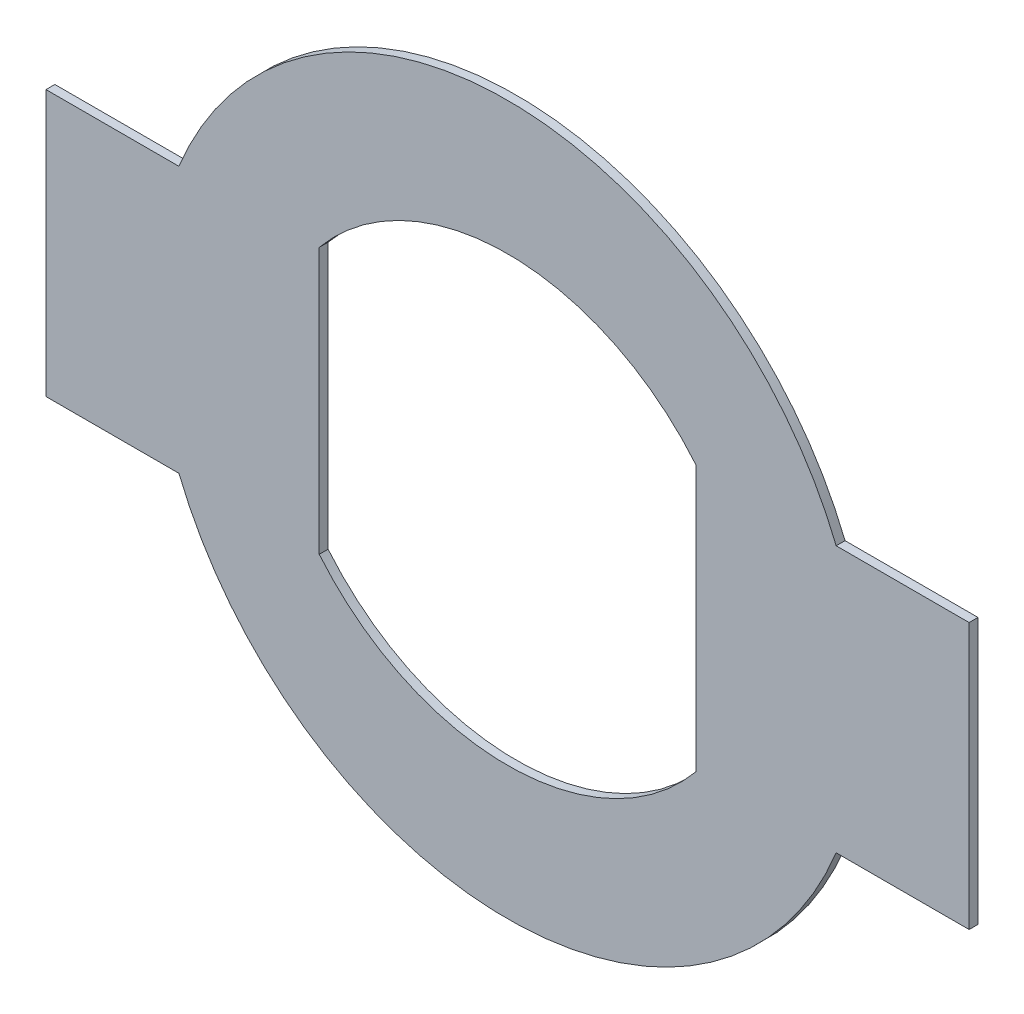
ISO-10303-21;
HEADER;
FILE_DESCRIPTION(('STEP AP214'),'2;1');
FILE_NAME('part.step','',(''),(''),'','','');
FILE_SCHEMA(('AUTOMOTIVE_DESIGN { 1 0 10303 214 1 1 1 1 }'));
ENDSEC;
DATA;
#1=APPLICATION_CONTEXT('core data for automotive mechanical design processes');
#2=APPLICATION_PROTOCOL_DEFINITION('international standard','automotive_design',2000,#1);
#3=PRODUCT_CONTEXT('',#1,'mechanical');
#4=PRODUCT('Part','Part','',(#3));
#5=PRODUCT_RELATED_PRODUCT_CATEGORY('part','',(#4));
#6=PRODUCT_DEFINITION_FORMATION('','',#4);
#7=PRODUCT_DEFINITION_CONTEXT('part definition',#1,'design');
#8=PRODUCT_DEFINITION('design','',#6,#7);
#9=PRODUCT_DEFINITION_SHAPE('','',#8);
#10=(LENGTH_UNIT() NAMED_UNIT(*) SI_UNIT(.MILLI.,.METRE.));
#11=(NAMED_UNIT(*) PLANE_ANGLE_UNIT() SI_UNIT($,.RADIAN.));
#12=(NAMED_UNIT(*) SI_UNIT($,.STERADIAN.) SOLID_ANGLE_UNIT());
#13=UNCERTAINTY_MEASURE_WITH_UNIT(LENGTH_MEASURE(1.E-05),#10,'distance_accuracy_value','');
#14=(GEOMETRIC_REPRESENTATION_CONTEXT(3) GLOBAL_UNCERTAINTY_ASSIGNED_CONTEXT((#13)) GLOBAL_UNIT_ASSIGNED_CONTEXT((#10,
#11,#12)) REPRESENTATION_CONTEXT('',''));
#15=CARTESIAN_POINT('',(0.,0.,0.));
#16=DIRECTION('',(0.,0.,1.));
#17=DIRECTION('',(1.,0.,0.));
#18=AXIS2_PLACEMENT_3D('',#15,#16,#17);
#19=CARTESIAN_POINT('',(0.,0.,-0.2));
#20=DIRECTION('',(0.,0.,1.));
#21=DIRECTION('',(1.,0.,0.));
#22=AXIS2_PLACEMENT_3D('',#19,#20,#21);
#23=CYLINDRICAL_SURFACE('',#22,8.);
#24=CARTESIAN_POINT('',(0.,0.,0.));
#25=DIRECTION('',(0.,0.,1.));
#26=DIRECTION('',(1.,0.,0.));
#27=AXIS2_PLACEMENT_3D('',#24,#25,#26);
#28=CIRCLE('',#27,8.);
#29=CARTESIAN_POINT('',(-7.41619848709566,-3.,0.));
#30=VERTEX_POINT('',#29);
#31=CARTESIAN_POINT('',(7.41619848709566,-3.,0.));
#32=VERTEX_POINT('',#31);
#33=EDGE_CURVE('E157',#30,#32,#28,.T.);
#34=ORIENTED_EDGE('',*,*,#33,.F.);
#35=DIRECTION('',(0.,0.,1.));
#36=VECTOR('',#35,1.);
#37=CARTESIAN_POINT('',(-7.41619848709566,-3.,-0.2));
#38=LINE('',#37,#36);
#39=CARTESIAN_POINT('',(-7.41619848709566,-3.,-0.2));
#40=VERTEX_POINT('',#39);
#41=EDGE_CURVE('E11',#40,#30,#38,.T.);
#42=ORIENTED_EDGE('',*,*,#41,.F.);
#43=CARTESIAN_POINT('',(0.,0.,-0.2));
#44=DIRECTION('',(0.,0.,1.));
#45=DIRECTION('',(1.,0.,0.));
#46=AXIS2_PLACEMENT_3D('',#43,#44,#45);
#47=CIRCLE('',#46,8.);
#48=CARTESIAN_POINT('',(7.41619848709566,-3.,-0.2));
#49=VERTEX_POINT('',#48);
#50=EDGE_CURVE('E161',#40,#49,#47,.T.);
#51=ORIENTED_EDGE('',*,*,#50,.T.);
#52=DIRECTION('',(0.,0.,1.));
#53=VECTOR('',#52,1.);
#54=CARTESIAN_POINT('',(7.41619848709566,-3.,-0.2));
#55=LINE('',#54,#53);
#56=EDGE_CURVE('E38',#49,#32,#55,.T.);
#57=ORIENTED_EDGE('',*,*,#56,.T.);
#58=EDGE_LOOP('',(#34,#42,#51,#57));
#59=FACE_BOUND('',#58,.T.);
#60=ADVANCED_FACE('F35',(#59),#23,.T.);
#61=CARTESIAN_POINT('',(-10.4161984870957,-3.,-0.2));
#62=DIRECTION('',(0.,-1.,0.));
#63=DIRECTION('',(0.,0.,-1.));
#64=AXIS2_PLACEMENT_3D('',#61,#62,#63);
#65=PLANE('',#64);
#66=DIRECTION('',(1.,0.,0.));
#67=VECTOR('',#66,1.);
#68=CARTESIAN_POINT('',(-10.4161984870957,-3.,0.));
#69=LINE('',#68,#67);
#70=CARTESIAN_POINT('',(-10.4161984870957,-3.,0.));
#71=VERTEX_POINT('',#70);
#72=EDGE_CURVE('E165',#71,#30,#69,.T.);
#73=ORIENTED_EDGE('',*,*,#72,.F.);
#74=DIRECTION('',(0.,0.,1.));
#75=VECTOR('',#74,1.);
#76=CARTESIAN_POINT('',(-10.4161984870957,-3.,-0.2));
#77=LINE('',#76,#75);
#78=CARTESIAN_POINT('',(-10.4161984870957,-3.,-0.2));
#79=VERTEX_POINT('',#78);
#80=EDGE_CURVE('E43',#79,#71,#77,.T.);
#81=ORIENTED_EDGE('',*,*,#80,.F.);
#82=DIRECTION('',(1.,0.,0.));
#83=VECTOR('',#82,1.);
#84=CARTESIAN_POINT('',(-10.4161984870957,-3.,-0.2));
#85=LINE('',#84,#83);
#86=EDGE_CURVE('E183',#79,#40,#85,.T.);
#87=ORIENTED_EDGE('',*,*,#86,.T.);
#88=ORIENTED_EDGE('',*,*,#41,.T.);
#89=EDGE_LOOP('',(#73,#81,#87,#88));
#90=FACE_BOUND('',#89,.T.);
#91=ADVANCED_FACE('F230',(#90),#65,.T.);
#92=CARTESIAN_POINT('',(-10.4161984870957,3.,-0.2));
#93=DIRECTION('',(-1.,0.,0.));
#94=DIRECTION('',(0.,0.,1.));
#95=AXIS2_PLACEMENT_3D('',#92,#93,#94);
#96=PLANE('',#95);
#97=DIRECTION('',(0.,-1.,0.));
#98=VECTOR('',#97,1.);
#99=CARTESIAN_POINT('',(-10.4161984870957,3.,0.));
#100=LINE('',#99,#98);
#101=CARTESIAN_POINT('',(-10.4161984870957,3.,0.));
#102=VERTEX_POINT('',#101);
#103=EDGE_CURVE('E203',#102,#71,#100,.T.);
#104=ORIENTED_EDGE('',*,*,#103,.F.);
#105=DIRECTION('',(0.,0.,1.));
#106=VECTOR('',#105,1.);
#107=CARTESIAN_POINT('',(-10.4161984870957,3.,-0.2));
#108=LINE('',#107,#106);
#109=CARTESIAN_POINT('',(-10.4161984870957,3.,-0.2));
#110=VERTEX_POINT('',#109);
#111=EDGE_CURVE('E209',#110,#102,#108,.T.);
#112=ORIENTED_EDGE('',*,*,#111,.F.);
#113=DIRECTION('',(0.,-1.,0.));
#114=VECTOR('',#113,1.);
#115=CARTESIAN_POINT('',(-10.4161984870957,3.,-0.2));
#116=LINE('',#115,#114);
#117=EDGE_CURVE('E180',#110,#79,#116,.T.);
#118=ORIENTED_EDGE('',*,*,#117,.T.);
#119=ORIENTED_EDGE('',*,*,#80,.T.);
#120=EDGE_LOOP('',(#104,#112,#118,#119));
#121=FACE_BOUND('',#120,.T.);
#122=ADVANCED_FACE('F249',(#121),#96,.T.);
#123=CARTESIAN_POINT('',(-7.41619848709566,3.,-0.2));
#124=DIRECTION('',(0.,1.,0.));
#125=DIRECTION('',(0.,0.,1.));
#126=AXIS2_PLACEMENT_3D('',#123,#124,#125);
#127=PLANE('',#126);
#128=DIRECTION('',(-1.,0.,0.));
#129=VECTOR('',#128,1.);
#130=CARTESIAN_POINT('',(-7.41619848709566,3.,0.));
#131=LINE('',#130,#129);
#132=CARTESIAN_POINT('',(-7.41619848709566,3.,0.));
#133=VERTEX_POINT('',#132);
#134=EDGE_CURVE('E200',#133,#102,#131,.T.);
#135=ORIENTED_EDGE('',*,*,#134,.F.);
#136=DIRECTION('',(0.,0.,1.));
#137=VECTOR('',#136,1.);
#138=CARTESIAN_POINT('',(-7.41619848709566,3.,-0.2));
#139=LINE('',#138,#137);
#140=CARTESIAN_POINT('',(-7.41619848709566,3.,-0.2));
#141=VERTEX_POINT('',#140);
#142=EDGE_CURVE('E211',#141,#133,#139,.T.);
#143=ORIENTED_EDGE('',*,*,#142,.F.);
#144=DIRECTION('',(-1.,0.,0.));
#145=VECTOR('',#144,1.);
#146=CARTESIAN_POINT('',(-7.41619848709566,3.,-0.2));
#147=LINE('',#146,#145);
#148=EDGE_CURVE('E177',#141,#110,#147,.T.);
#149=ORIENTED_EDGE('',*,*,#148,.T.);
#150=ORIENTED_EDGE('',*,*,#111,.T.);
#151=EDGE_LOOP('',(#135,#143,#149,#150));
#152=FACE_BOUND('',#151,.T.);
#153=ADVANCED_FACE('F247',(#152),#127,.T.);
#154=CARTESIAN_POINT('',(0.,0.,-0.2));
#155=DIRECTION('',(0.,0.,1.));
#156=DIRECTION('',(1.,0.,0.));
#157=AXIS2_PLACEMENT_3D('',#154,#155,#156);
#158=CYLINDRICAL_SURFACE('',#157,8.);
#159=CARTESIAN_POINT('',(0.,0.,0.));
#160=DIRECTION('',(0.,0.,1.));
#161=DIRECTION('',(1.,0.,0.));
#162=AXIS2_PLACEMENT_3D('',#159,#160,#161);
#163=CIRCLE('',#162,8.);
#164=CARTESIAN_POINT('',(7.41619848709566,3.,0.));
#165=VERTEX_POINT('',#164);
#166=EDGE_CURVE('E197',#165,#133,#163,.T.);
#167=ORIENTED_EDGE('',*,*,#166,.F.);
#168=DIRECTION('',(0.,0.,1.));
#169=VECTOR('',#168,1.);
#170=CARTESIAN_POINT('',(7.41619848709566,3.,-0.2));
#171=LINE('',#170,#169);
#172=CARTESIAN_POINT('',(7.41619848709566,3.,-0.2));
#173=VERTEX_POINT('',#172);
#174=EDGE_CURVE('E213',#173,#165,#171,.T.);
#175=ORIENTED_EDGE('',*,*,#174,.F.);
#176=CARTESIAN_POINT('',(0.,0.,-0.2));
#177=DIRECTION('',(0.,0.,1.));
#178=DIRECTION('',(1.,0.,0.));
#179=AXIS2_PLACEMENT_3D('',#176,#177,#178);
#180=CIRCLE('',#179,8.);
#181=EDGE_CURVE('E174',#173,#141,#180,.T.);
#182=ORIENTED_EDGE('',*,*,#181,.T.);
#183=ORIENTED_EDGE('',*,*,#142,.T.);
#184=EDGE_LOOP('',(#167,#175,#182,#183));
#185=FACE_BOUND('',#184,.T.);
#186=ADVANCED_FACE('F243',(#185),#158,.T.);
#187=CARTESIAN_POINT('',(7.41619848709566,3.,-0.2));
#188=DIRECTION('',(0.,1.,0.));
#189=DIRECTION('',(0.,0.,1.));
#190=AXIS2_PLACEMENT_3D('',#187,#188,#189);
#191=PLANE('',#190);
#192=DIRECTION('',(-1.,0.,0.));
#193=VECTOR('',#192,1.);
#194=CARTESIAN_POINT('',(7.41619848709566,3.,0.));
#195=LINE('',#194,#193);
#196=CARTESIAN_POINT('',(10.4161984870957,3.,0.));
#197=VERTEX_POINT('',#196);
#198=EDGE_CURVE('E194',#197,#165,#195,.T.);
#199=ORIENTED_EDGE('',*,*,#198,.F.);
#200=DIRECTION('',(0.,0.,1.));
#201=VECTOR('',#200,1.);
#202=CARTESIAN_POINT('',(10.4161984870957,3.,-0.2));
#203=LINE('',#202,#201);
#204=CARTESIAN_POINT('',(10.4161984870957,3.,-0.2));
#205=VERTEX_POINT('',#204);
#206=EDGE_CURVE('E215',#205,#197,#203,.T.);
#207=ORIENTED_EDGE('',*,*,#206,.F.);
#208=DIRECTION('',(-1.,0.,0.));
#209=VECTOR('',#208,1.);
#210=CARTESIAN_POINT('',(7.41619848709566,3.,-0.2));
#211=LINE('',#210,#209);
#212=EDGE_CURVE('E171',#205,#173,#211,.T.);
#213=ORIENTED_EDGE('',*,*,#212,.T.);
#214=ORIENTED_EDGE('',*,*,#174,.T.);
#215=EDGE_LOOP('',(#199,#207,#213,#214));
#216=FACE_BOUND('',#215,.T.);
#217=ADVANCED_FACE('F241',(#216),#191,.T.);
#218=CARTESIAN_POINT('',(10.4161984870957,3.,-0.2));
#219=DIRECTION('',(1.,0.,0.));
#220=DIRECTION('',(0.,0.,-1.));
#221=AXIS2_PLACEMENT_3D('',#218,#219,#220);
#222=PLANE('',#221);
#223=DIRECTION('',(0.,1.,0.));
#224=VECTOR('',#223,1.);
#225=CARTESIAN_POINT('',(10.4161984870957,3.,0.));
#226=LINE('',#225,#224);
#227=CARTESIAN_POINT('',(10.4161984870957,-3.,0.));
#228=VERTEX_POINT('',#227);
#229=EDGE_CURVE('E191',#228,#197,#226,.T.);
#230=ORIENTED_EDGE('',*,*,#229,.F.);
#231=DIRECTION('',(0.,0.,1.));
#232=VECTOR('',#231,1.);
#233=CARTESIAN_POINT('',(10.4161984870957,-3.,-0.2));
#234=LINE('',#233,#232);
#235=CARTESIAN_POINT('',(10.4161984870957,-3.,-0.2));
#236=VERTEX_POINT('',#235);
#237=EDGE_CURVE('E216',#236,#228,#234,.T.);
#238=ORIENTED_EDGE('',*,*,#237,.F.);
#239=DIRECTION('',(0.,1.,0.));
#240=VECTOR('',#239,1.);
#241=CARTESIAN_POINT('',(10.4161984870957,3.,-0.2));
#242=LINE('',#241,#240);
#243=EDGE_CURVE('E168',#236,#205,#242,.T.);
#244=ORIENTED_EDGE('',*,*,#243,.T.);
#245=ORIENTED_EDGE('',*,*,#206,.T.);
#246=EDGE_LOOP('',(#230,#238,#244,#245));
#247=FACE_BOUND('',#246,.T.);
#248=ADVANCED_FACE('F237',(#247),#222,.T.);
#249=CARTESIAN_POINT('',(10.4161984870957,-3.,-0.2));
#250=DIRECTION('',(0.,-1.,0.));
#251=DIRECTION('',(0.,0.,-1.));
#252=AXIS2_PLACEMENT_3D('',#249,#250,#251);
#253=PLANE('',#252);
#254=DIRECTION('',(1.,0.,0.));
#255=VECTOR('',#254,1.);
#256=CARTESIAN_POINT('',(10.4161984870957,-3.,0.));
#257=LINE('',#256,#255);
#258=EDGE_CURVE('E188',#32,#228,#257,.T.);
#259=ORIENTED_EDGE('',*,*,#258,.F.);
#260=ORIENTED_EDGE('',*,*,#56,.F.);
#261=DIRECTION('',(1.,0.,0.));
#262=VECTOR('',#261,1.);
#263=CARTESIAN_POINT('',(10.4161984870957,-3.,-0.2));
#264=LINE('',#263,#262);
#265=EDGE_CURVE('E164',#49,#236,#264,.T.);
#266=ORIENTED_EDGE('',*,*,#265,.T.);
#267=ORIENTED_EDGE('',*,*,#237,.T.);
#268=EDGE_LOOP('',(#259,#260,#266,#267));
#269=FACE_BOUND('',#268,.T.);
#270=ADVANCED_FACE('F224',(#269),#253,.T.);
#271=CARTESIAN_POINT('',(0.,0.,-0.2));
#272=DIRECTION('',(0.,0.,1.));
#273=DIRECTION('',(1.,0.,0.));
#274=AXIS2_PLACEMENT_3D('',#271,#272,#273);
#275=PLANE('',#274);
#276=DIRECTION('',(0.,1.,0.));
#277=VECTOR('',#276,1.);
#278=CARTESIAN_POINT('',(4.25,3.,-0.2));
#279=LINE('',#278,#277);
#280=CARTESIAN_POINT('',(4.25,-3.,-0.2));
#281=VERTEX_POINT('',#280);
#282=CARTESIAN_POINT('',(4.25,3.,-0.2));
#283=VERTEX_POINT('',#282);
#284=EDGE_CURVE('E132',#281,#283,#279,.T.);
#285=ORIENTED_EDGE('',*,*,#284,.T.);
#286=CARTESIAN_POINT('',(0.,-0.515625000000006,-0.2));
#287=DIRECTION('',(0.,0.,1.));
#288=DIRECTION('',(-1.,0.,0.));
#289=AXIS2_PLACEMENT_3D('',#286,#287,#288);
#290=CIRCLE('',#289,5.515625);
#291=CARTESIAN_POINT('',(-4.25,3.,-0.2));
#292=VERTEX_POINT('',#291);
#293=EDGE_CURVE('E126',#283,#292,#290,.T.);
#294=ORIENTED_EDGE('',*,*,#293,.T.);
#295=DIRECTION('',(0.,-1.,0.));
#296=VECTOR('',#295,1.);
#297=CARTESIAN_POINT('',(-4.25,3.,-0.2));
#298=LINE('',#297,#296);
#299=CARTESIAN_POINT('',(-4.25,-3.,-0.2));
#300=VERTEX_POINT('',#299);
#301=EDGE_CURVE('E135',#292,#300,#298,.T.);
#302=ORIENTED_EDGE('',*,*,#301,.T.);
#303=CARTESIAN_POINT('',(0.,0.515625000000006,-0.2));
#304=DIRECTION('',(0.,0.,1.));
#305=DIRECTION('',(1.,0.,0.));
#306=AXIS2_PLACEMENT_3D('',#303,#304,#305);
#307=CIRCLE('',#306,5.515625);
#308=EDGE_CURVE('E51',#300,#281,#307,.T.);
#309=ORIENTED_EDGE('',*,*,#308,.T.);
#310=EDGE_LOOP('',(#285,#294,#302,#309));
#311=FACE_BOUND('',#310,.T.);
#312=ORIENTED_EDGE('',*,*,#50,.F.);
#313=ORIENTED_EDGE('',*,*,#86,.F.);
#314=ORIENTED_EDGE('',*,*,#117,.F.);
#315=ORIENTED_EDGE('',*,*,#148,.F.);
#316=ORIENTED_EDGE('',*,*,#181,.F.);
#317=ORIENTED_EDGE('',*,*,#212,.F.);
#318=ORIENTED_EDGE('',*,*,#243,.F.);
#319=ORIENTED_EDGE('',*,*,#265,.F.);
#320=EDGE_LOOP('',(#312,#313,#314,#315,#316,#317,#318,#319));
#321=FACE_BOUND('',#320,.T.);
#322=ADVANCED_FACE('F139',(#311,#321),#275,.F.);
#323=CARTESIAN_POINT('',(0.,0.,0.));
#324=DIRECTION('',(0.,0.,1.));
#325=DIRECTION('',(1.,0.,0.));
#326=AXIS2_PLACEMENT_3D('',#323,#324,#325);
#327=PLANE('',#326);
#328=CARTESIAN_POINT('',(0.,-0.515625000000006,0.));
#329=DIRECTION('',(0.,0.,1.));
#330=DIRECTION('',(-1.,0.,0.));
#331=AXIS2_PLACEMENT_3D('',#328,#329,#330);
#332=CIRCLE('',#331,5.515625);
#333=CARTESIAN_POINT('',(4.25,3.,0.));
#334=VERTEX_POINT('',#333);
#335=CARTESIAN_POINT('',(-4.25,3.,0.));
#336=VERTEX_POINT('',#335);
#337=EDGE_CURVE('E59',#334,#336,#332,.T.);
#338=ORIENTED_EDGE('',*,*,#337,.F.);
#339=DIRECTION('',(0.,1.,0.));
#340=VECTOR('',#339,1.);
#341=CARTESIAN_POINT('',(4.25,3.,0.));
#342=LINE('',#341,#340);
#343=CARTESIAN_POINT('',(4.25,-3.,0.));
#344=VERTEX_POINT('',#343);
#345=EDGE_CURVE('E142',#344,#334,#342,.T.);
#346=ORIENTED_EDGE('',*,*,#345,.F.);
#347=CARTESIAN_POINT('',(0.,0.515625000000006,0.));
#348=DIRECTION('',(0.,0.,1.));
#349=DIRECTION('',(1.,0.,0.));
#350=AXIS2_PLACEMENT_3D('',#347,#348,#349);
#351=CIRCLE('',#350,5.515625);
#352=CARTESIAN_POINT('',(-4.25,-3.,0.));
#353=VERTEX_POINT('',#352);
#354=EDGE_CURVE('E145',#353,#344,#351,.T.);
#355=ORIENTED_EDGE('',*,*,#354,.F.);
#356=DIRECTION('',(0.,-1.,0.));
#357=VECTOR('',#356,1.);
#358=CARTESIAN_POINT('',(-4.25,3.,0.));
#359=LINE('',#358,#357);
#360=EDGE_CURVE('E151',#336,#353,#359,.T.);
#361=ORIENTED_EDGE('',*,*,#360,.F.);
#362=EDGE_LOOP('',(#338,#346,#355,#361));
#363=FACE_BOUND('',#362,.T.);
#364=ORIENTED_EDGE('',*,*,#33,.T.);
#365=ORIENTED_EDGE('',*,*,#258,.T.);
#366=ORIENTED_EDGE('',*,*,#229,.T.);
#367=ORIENTED_EDGE('',*,*,#198,.T.);
#368=ORIENTED_EDGE('',*,*,#166,.T.);
#369=ORIENTED_EDGE('',*,*,#134,.T.);
#370=ORIENTED_EDGE('',*,*,#103,.T.);
#371=ORIENTED_EDGE('',*,*,#72,.T.);
#372=EDGE_LOOP('',(#364,#365,#366,#367,#368,#369,#370,#371));
#373=FACE_BOUND('',#372,.T.);
#374=ADVANCED_FACE('F226',(#363,#373),#327,.T.);
#375=CARTESIAN_POINT('',(0.,-0.515625000000006,-0.2));
#376=DIRECTION('',(0.,0.,1.));
#377=DIRECTION('',(1.,0.,0.));
#378=AXIS2_PLACEMENT_3D('',#375,#376,#377);
#379=CYLINDRICAL_SURFACE('',#378,5.515625);
#380=ORIENTED_EDGE('',*,*,#337,.T.);
#381=DIRECTION('',(0.,0.,1.));
#382=VECTOR('',#381,1.);
#383=CARTESIAN_POINT('',(-4.25,3.,-0.2));
#384=LINE('',#383,#382);
#385=EDGE_CURVE('E122',#292,#336,#384,.T.);
#386=ORIENTED_EDGE('',*,*,#385,.F.);
#387=ORIENTED_EDGE('',*,*,#293,.F.);
#388=DIRECTION('',(0.,0.,1.));
#389=VECTOR('',#388,1.);
#390=CARTESIAN_POINT('',(4.25,3.,-0.2));
#391=LINE('',#390,#389);
#392=EDGE_CURVE('E155',#283,#334,#391,.T.);
#393=ORIENTED_EDGE('',*,*,#392,.T.);
#394=EDGE_LOOP('',(#380,#386,#387,#393));
#395=FACE_BOUND('',#394,.T.);
#396=ADVANCED_FACE('F124',(#395),#379,.F.);
#397=CARTESIAN_POINT('',(4.25,3.,-0.2));
#398=DIRECTION('',(1.,0.,0.));
#399=DIRECTION('',(0.,0.,-1.));
#400=AXIS2_PLACEMENT_3D('',#397,#398,#399);
#401=PLANE('',#400);
#402=ORIENTED_EDGE('',*,*,#345,.T.);
#403=ORIENTED_EDGE('',*,*,#392,.F.);
#404=ORIENTED_EDGE('',*,*,#284,.F.);
#405=DIRECTION('',(0.,0.,1.));
#406=VECTOR('',#405,1.);
#407=CARTESIAN_POINT('',(4.25,-3.,-0.2));
#408=LINE('',#407,#406);
#409=EDGE_CURVE('E158',#281,#344,#408,.T.);
#410=ORIENTED_EDGE('',*,*,#409,.T.);
#411=EDGE_LOOP('',(#402,#403,#404,#410));
#412=FACE_BOUND('',#411,.T.);
#413=ADVANCED_FACE('F341',(#412),#401,.F.);
#414=CARTESIAN_POINT('',(0.,0.515625000000006,-0.2));
#415=DIRECTION('',(0.,0.,1.));
#416=DIRECTION('',(1.,0.,0.));
#417=AXIS2_PLACEMENT_3D('',#414,#415,#416);
#418=CYLINDRICAL_SURFACE('',#417,5.515625);
#419=ORIENTED_EDGE('',*,*,#354,.T.);
#420=ORIENTED_EDGE('',*,*,#409,.F.);
#421=ORIENTED_EDGE('',*,*,#308,.F.);
#422=DIRECTION('',(0.,0.,1.));
#423=VECTOR('',#422,1.);
#424=CARTESIAN_POINT('',(-4.25,-3.,-0.2));
#425=LINE('',#424,#423);
#426=EDGE_CURVE('E131',#300,#353,#425,.T.);
#427=ORIENTED_EDGE('',*,*,#426,.T.);
#428=EDGE_LOOP('',(#419,#420,#421,#427));
#429=FACE_BOUND('',#428,.T.);
#430=ADVANCED_FACE('F351',(#429),#418,.F.);
#431=CARTESIAN_POINT('',(-4.25,3.,-0.2));
#432=DIRECTION('',(-1.,0.,0.));
#433=DIRECTION('',(0.,0.,1.));
#434=AXIS2_PLACEMENT_3D('',#431,#432,#433);
#435=PLANE('',#434);
#436=ORIENTED_EDGE('',*,*,#360,.T.);
#437=ORIENTED_EDGE('',*,*,#426,.F.);
#438=ORIENTED_EDGE('',*,*,#301,.F.);
#439=ORIENTED_EDGE('',*,*,#385,.T.);
#440=EDGE_LOOP('',(#436,#437,#438,#439));
#441=FACE_BOUND('',#440,.T.);
#442=ADVANCED_FACE('F136',(#441),#435,.F.);
#443=CLOSED_SHELL('',(#60,#91,#122,#153,#186,#217,#248,#270,#322,#374,#396,#413,#430,#442));
#444=MANIFOLD_SOLID_BREP('B2',#443);
#445=ADVANCED_BREP_SHAPE_REPRESENTATION('',(#18,#444),#14);
#446=SHAPE_DEFINITION_REPRESENTATION(#9,#445);
ENDSEC;
END-ISO-10303-21;
